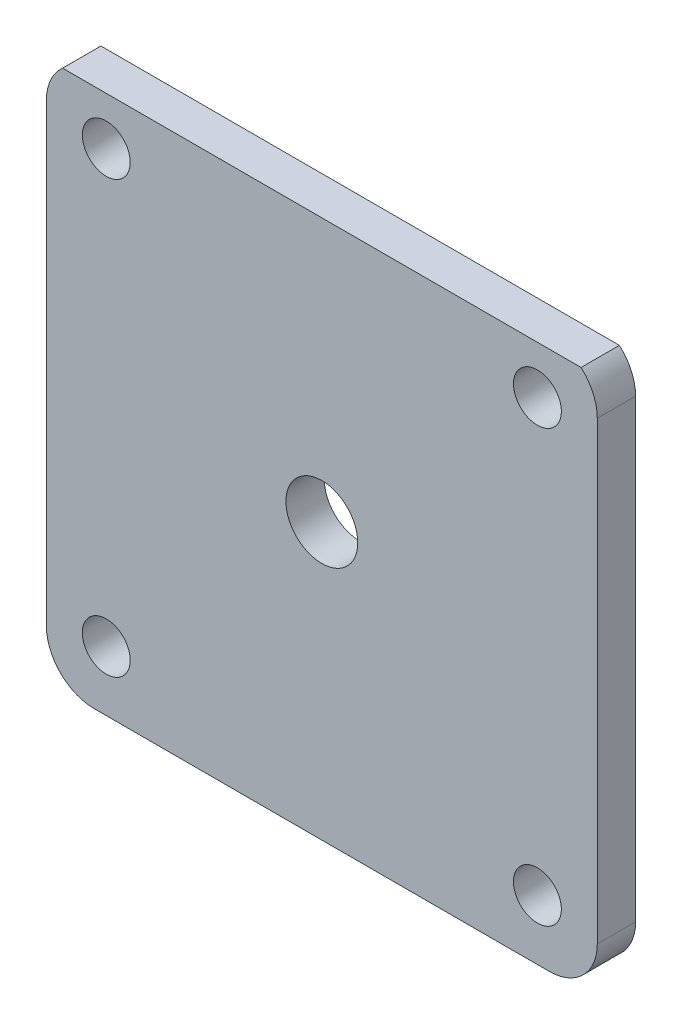
ISO-10303-21;
HEADER;
FILE_DESCRIPTION(('STEP AP214'),'2;1');
FILE_NAME('part.step','',(''),(''),'','','');
FILE_SCHEMA(('AUTOMOTIVE_DESIGN { 1 0 10303 214 1 1 1 1 }'));
ENDSEC;
DATA;
#1=APPLICATION_CONTEXT('core data for automotive mechanical design processes');
#2=APPLICATION_PROTOCOL_DEFINITION('international standard','automotive_design',2000,#1);
#3=PRODUCT_CONTEXT('',#1,'mechanical');
#4=PRODUCT('Part','Part','',(#3));
#5=PRODUCT_RELATED_PRODUCT_CATEGORY('part','',(#4));
#6=PRODUCT_DEFINITION_FORMATION('','',#4);
#7=PRODUCT_DEFINITION_CONTEXT('part definition',#1,'design');
#8=PRODUCT_DEFINITION('design','',#6,#7);
#9=PRODUCT_DEFINITION_SHAPE('','',#8);
#10=(LENGTH_UNIT() NAMED_UNIT(*) SI_UNIT(.MILLI.,.METRE.));
#11=(NAMED_UNIT(*) PLANE_ANGLE_UNIT() SI_UNIT($,.RADIAN.));
#12=(NAMED_UNIT(*) SI_UNIT($,.STERADIAN.) SOLID_ANGLE_UNIT());
#13=UNCERTAINTY_MEASURE_WITH_UNIT(LENGTH_MEASURE(1.E-05),#10,'distance_accuracy_value','');
#14=(GEOMETRIC_REPRESENTATION_CONTEXT(3) GLOBAL_UNCERTAINTY_ASSIGNED_CONTEXT((#13)) GLOBAL_UNIT_ASSIGNED_CONTEXT((#10,
#11,#12)) REPRESENTATION_CONTEXT('',''));
#15=CARTESIAN_POINT('',(0.,0.,0.));
#16=DIRECTION('',(0.,0.,1.));
#17=DIRECTION('',(1.,0.,0.));
#18=AXIS2_PLACEMENT_3D('',#15,#16,#17);
#19=CARTESIAN_POINT('',(9.5,-9.5,1.6));
#20=DIRECTION('',(0.,0.,1.));
#21=DIRECTION('',(1.,0.,0.));
#22=AXIS2_PLACEMENT_3D('',#19,#20,#21);
#23=PLANE('',#22);
#24=DIRECTION('',(1.,0.,0.));
#25=VECTOR('',#24,1.);
#26=CARTESIAN_POINT('',(9.5,11.,1.6));
#27=LINE('',#26,#25);
#28=CARTESIAN_POINT('',(-10.8228756555323,11.,1.6));
#29=VERTEX_POINT('',#28);
#30=CARTESIAN_POINT('',(10.8228756555323,11.,1.6));
#31=VERTEX_POINT('',#30);
#32=EDGE_CURVE('E194',#29,#31,#27,.T.);
#33=ORIENTED_EDGE('',*,*,#32,.F.);
#34=CARTESIAN_POINT('',(-9.5,9.5,1.6));
#35=DIRECTION('',(0.,0.,1.));
#36=DIRECTION('',(-1.,0.,0.));
#37=AXIS2_PLACEMENT_3D('',#34,#35,#36);
#38=CIRCLE('',#37,2.);
#39=CARTESIAN_POINT('',(-11.5,9.49999999999999,1.6));
#40=VERTEX_POINT('',#39);
#41=EDGE_CURVE('E116',#29,#40,#38,.T.);
#42=ORIENTED_EDGE('',*,*,#41,.T.);
#43=DIRECTION('',(0.,-1.,0.));
#44=VECTOR('',#43,1.);
#45=CARTESIAN_POINT('',(-11.5,-9.5,1.6));
#46=LINE('',#45,#44);
#47=CARTESIAN_POINT('',(-11.5,-9.5,1.6));
#48=VERTEX_POINT('',#47);
#49=EDGE_CURVE('E108',#40,#48,#46,.T.);
#50=ORIENTED_EDGE('',*,*,#49,.T.);
#51=CARTESIAN_POINT('',(-9.5,-9.5,1.6));
#52=DIRECTION('',(0.,0.,1.));
#53=DIRECTION('',(-1.,0.,0.));
#54=AXIS2_PLACEMENT_3D('',#51,#52,#53);
#55=CIRCLE('',#54,2.);
#56=CARTESIAN_POINT('',(-9.5,-11.5,1.6));
#57=VERTEX_POINT('',#56);
#58=EDGE_CURVE('E113',#48,#57,#55,.T.);
#59=ORIENTED_EDGE('',*,*,#58,.T.);
#60=DIRECTION('',(1.,0.,0.));
#61=VECTOR('',#60,1.);
#62=CARTESIAN_POINT('',(-9.5,-11.5,1.6));
#63=LINE('',#62,#61);
#64=CARTESIAN_POINT('',(9.50000000000001,-11.5,1.6));
#65=VERTEX_POINT('',#64);
#66=EDGE_CURVE('E63',#57,#65,#63,.T.);
#67=ORIENTED_EDGE('',*,*,#66,.T.);
#68=CARTESIAN_POINT('',(9.5,-9.5,1.6));
#69=DIRECTION('',(0.,0.,1.));
#70=DIRECTION('',(1.,0.,0.));
#71=AXIS2_PLACEMENT_3D('',#68,#69,#70);
#72=CIRCLE('',#71,2.);
#73=CARTESIAN_POINT('',(11.5,-9.5,1.6));
#74=VERTEX_POINT('',#73);
#75=EDGE_CURVE('E163',#65,#74,#72,.T.);
#76=ORIENTED_EDGE('',*,*,#75,.T.);
#77=DIRECTION('',(0.,1.,0.));
#78=VECTOR('',#77,1.);
#79=CARTESIAN_POINT('',(11.5,-9.5,1.6));
#80=LINE('',#79,#78);
#81=CARTESIAN_POINT('',(11.5,9.5,1.6));
#82=VERTEX_POINT('',#81);
#83=EDGE_CURVE('E99',#74,#82,#80,.T.);
#84=ORIENTED_EDGE('',*,*,#83,.T.);
#85=CARTESIAN_POINT('',(9.5,9.5,1.6));
#86=DIRECTION('',(0.,0.,1.));
#87=DIRECTION('',(-1.,0.,0.));
#88=AXIS2_PLACEMENT_3D('',#85,#86,#87);
#89=CIRCLE('',#88,2.);
#90=EDGE_CURVE('E246',#82,#31,#89,.T.);
#91=ORIENTED_EDGE('',*,*,#90,.T.);
#92=EDGE_LOOP('',(#33,#42,#50,#59,#67,#76,#84,#91));
#93=FACE_BOUND('',#92,.T.);
#94=CARTESIAN_POINT('',(-9.,-9.,1.6));
#95=DIRECTION('',(0.,0.,1.));
#96=DIRECTION('',(1.,0.,0.));
#97=AXIS2_PLACEMENT_3D('',#94,#95,#96);
#98=CIRCLE('',#97,1.);
#99=CARTESIAN_POINT('',(-8.,-9.,1.6));
#100=VERTEX_POINT('',#99);
#101=EDGE_CURVE('E212',#100,#100,#98,.T.);
#102=ORIENTED_EDGE('',*,*,#101,.F.);
#103=EDGE_LOOP('',(#102));
#104=FACE_BOUND('',#103,.T.);
#105=CARTESIAN_POINT('',(9.,9.,1.6));
#106=DIRECTION('',(0.,0.,1.));
#107=DIRECTION('',(1.,0.,0.));
#108=AXIS2_PLACEMENT_3D('',#105,#106,#107);
#109=CIRCLE('',#108,0.999999999999999);
#110=CARTESIAN_POINT('',(10.,9.,1.6));
#111=VERTEX_POINT('',#110);
#112=EDGE_CURVE('E228',#111,#111,#109,.T.);
#113=ORIENTED_EDGE('',*,*,#112,.F.);
#114=EDGE_LOOP('',(#113));
#115=FACE_BOUND('',#114,.T.);
#116=CARTESIAN_POINT('',(0.,0.,1.6));
#117=DIRECTION('',(0.,0.,1.));
#118=DIRECTION('',(1.,0.,0.));
#119=AXIS2_PLACEMENT_3D('',#116,#117,#118);
#120=CIRCLE('',#119,1.5);
#121=CARTESIAN_POINT('',(1.5,0.,1.6));
#122=VERTEX_POINT('',#121);
#123=EDGE_CURVE('E146',#122,#122,#120,.T.);
#124=ORIENTED_EDGE('',*,*,#123,.F.);
#125=EDGE_LOOP('',(#124));
#126=FACE_BOUND('',#125,.T.);
#127=CARTESIAN_POINT('',(-9.,8.99999999999999,1.6));
#128=DIRECTION('',(0.,0.,1.));
#129=DIRECTION('',(-1.,0.,0.));
#130=AXIS2_PLACEMENT_3D('',#127,#128,#129);
#131=CIRCLE('',#130,0.999999999999999);
#132=CARTESIAN_POINT('',(-10.,8.99999999999999,1.6));
#133=VERTEX_POINT('',#132);
#134=EDGE_CURVE('E220',#133,#133,#131,.T.);
#135=ORIENTED_EDGE('',*,*,#134,.F.);
#136=EDGE_LOOP('',(#135));
#137=FACE_BOUND('',#136,.T.);
#138=CARTESIAN_POINT('',(9.00000000000001,-9.,1.6));
#139=DIRECTION('',(0.,0.,1.));
#140=DIRECTION('',(-1.,0.,0.));
#141=AXIS2_PLACEMENT_3D('',#138,#139,#140);
#142=CIRCLE('',#141,0.999999999999998);
#143=CARTESIAN_POINT('',(8.00000000000001,-9.,1.6));
#144=VERTEX_POINT('',#143);
#145=EDGE_CURVE('E204',#144,#144,#142,.T.);
#146=ORIENTED_EDGE('',*,*,#145,.F.);
#147=EDGE_LOOP('',(#146));
#148=FACE_BOUND('',#147,.T.);
#149=ADVANCED_FACE('F39',(#93,#104,#115,#126,#137,#148),#23,.T.);
#150=CARTESIAN_POINT('',(9.5,-9.5,0.));
#151=DIRECTION('',(0.,0.,1.));
#152=DIRECTION('',(1.,0.,0.));
#153=AXIS2_PLACEMENT_3D('',#150,#151,#152);
#154=PLANE('',#153);
#155=CARTESIAN_POINT('',(-9.5,9.5,0.));
#156=DIRECTION('',(0.,0.,1.));
#157=DIRECTION('',(-1.,0.,0.));
#158=AXIS2_PLACEMENT_3D('',#155,#156,#157);
#159=CIRCLE('',#158,2.);
#160=CARTESIAN_POINT('',(-10.8228756555323,11.,0.));
#161=VERTEX_POINT('',#160);
#162=CARTESIAN_POINT('',(-11.5,9.49999999999999,0.));
#163=VERTEX_POINT('',#162);
#164=EDGE_CURVE('E153',#161,#163,#159,.T.);
#165=ORIENTED_EDGE('',*,*,#164,.F.);
#166=DIRECTION('',(-1.,0.,0.));
#167=VECTOR('',#166,1.);
#168=CARTESIAN_POINT('',(-12.53493011487,11.,0.));
#169=LINE('',#168,#167);
#170=CARTESIAN_POINT('',(10.8228756555323,11.,0.));
#171=VERTEX_POINT('',#170);
#172=EDGE_CURVE('E55',#171,#161,#169,.T.);
#173=ORIENTED_EDGE('',*,*,#172,.F.);
#174=CARTESIAN_POINT('',(9.5,9.5,0.));
#175=DIRECTION('',(0.,0.,1.));
#176=DIRECTION('',(-1.,0.,0.));
#177=AXIS2_PLACEMENT_3D('',#174,#175,#176);
#178=CIRCLE('',#177,2.);
#179=CARTESIAN_POINT('',(11.5,9.5,0.));
#180=VERTEX_POINT('',#179);
#181=EDGE_CURVE('E149',#180,#171,#178,.T.);
#182=ORIENTED_EDGE('',*,*,#181,.F.);
#183=DIRECTION('',(0.,1.,0.));
#184=VECTOR('',#183,1.);
#185=CARTESIAN_POINT('',(11.5,-9.5,0.));
#186=LINE('',#185,#184);
#187=CARTESIAN_POINT('',(11.5,-9.5,0.));
#188=VERTEX_POINT('',#187);
#189=EDGE_CURVE('E145',#188,#180,#186,.T.);
#190=ORIENTED_EDGE('',*,*,#189,.F.);
#191=CARTESIAN_POINT('',(9.5,-9.5,0.));
#192=DIRECTION('',(0.,0.,1.));
#193=DIRECTION('',(1.,0.,0.));
#194=AXIS2_PLACEMENT_3D('',#191,#192,#193);
#195=CIRCLE('',#194,2.);
#196=CARTESIAN_POINT('',(9.50000000000001,-11.5,0.));
#197=VERTEX_POINT('',#196);
#198=EDGE_CURVE('E141',#197,#188,#195,.T.);
#199=ORIENTED_EDGE('',*,*,#198,.F.);
#200=DIRECTION('',(1.,0.,0.));
#201=VECTOR('',#200,1.);
#202=CARTESIAN_POINT('',(-9.5,-11.5,0.));
#203=LINE('',#202,#201);
#204=CARTESIAN_POINT('',(-9.5,-11.5,0.));
#205=VERTEX_POINT('',#204);
#206=EDGE_CURVE('E90',#205,#197,#203,.T.);
#207=ORIENTED_EDGE('',*,*,#206,.F.);
#208=CARTESIAN_POINT('',(-9.5,-9.5,0.));
#209=DIRECTION('',(0.,0.,1.));
#210=DIRECTION('',(-1.,0.,0.));
#211=AXIS2_PLACEMENT_3D('',#208,#209,#210);
#212=CIRCLE('',#211,2.);
#213=CARTESIAN_POINT('',(-11.5,-9.5,0.));
#214=VERTEX_POINT('',#213);
#215=EDGE_CURVE('E158',#214,#205,#212,.T.);
#216=ORIENTED_EDGE('',*,*,#215,.F.);
#217=DIRECTION('',(0.,-1.,0.));
#218=VECTOR('',#217,1.);
#219=CARTESIAN_POINT('',(-11.5,-9.5,0.));
#220=LINE('',#219,#218);
#221=EDGE_CURVE('E126',#163,#214,#220,.T.);
#222=ORIENTED_EDGE('',*,*,#221,.F.);
#223=EDGE_LOOP('',(#165,#173,#182,#190,#199,#207,#216,#222));
#224=FACE_BOUND('',#223,.T.);
#225=CARTESIAN_POINT('',(0.,0.,0.));
#226=DIRECTION('',(0.,0.,1.));
#227=DIRECTION('',(1.,0.,0.));
#228=AXIS2_PLACEMENT_3D('',#225,#226,#227);
#229=CIRCLE('',#228,1.5);
#230=CARTESIAN_POINT('',(1.5,0.,0.));
#231=VERTEX_POINT('',#230);
#232=EDGE_CURVE('E232',#231,#231,#229,.T.);
#233=ORIENTED_EDGE('',*,*,#232,.T.);
#234=EDGE_LOOP('',(#233));
#235=FACE_BOUND('',#234,.T.);
#236=CARTESIAN_POINT('',(9.,9.,0.));
#237=DIRECTION('',(0.,0.,1.));
#238=DIRECTION('',(1.,0.,0.));
#239=AXIS2_PLACEMENT_3D('',#236,#237,#238);
#240=CIRCLE('',#239,0.999999999999999);
#241=CARTESIAN_POINT('',(10.,9.,0.));
#242=VERTEX_POINT('',#241);
#243=EDGE_CURVE('E224',#242,#242,#240,.T.);
#244=ORIENTED_EDGE('',*,*,#243,.T.);
#245=EDGE_LOOP('',(#244));
#246=FACE_BOUND('',#245,.T.);
#247=CARTESIAN_POINT('',(-9.,8.99999999999999,0.));
#248=DIRECTION('',(0.,0.,1.));
#249=DIRECTION('',(-1.,0.,0.));
#250=AXIS2_PLACEMENT_3D('',#247,#248,#249);
#251=CIRCLE('',#250,0.999999999999999);
#252=CARTESIAN_POINT('',(-10.,8.99999999999999,0.));
#253=VERTEX_POINT('',#252);
#254=EDGE_CURVE('E216',#253,#253,#251,.T.);
#255=ORIENTED_EDGE('',*,*,#254,.T.);
#256=EDGE_LOOP('',(#255));
#257=FACE_BOUND('',#256,.T.);
#258=CARTESIAN_POINT('',(-9.,-9.,0.));
#259=DIRECTION('',(0.,0.,1.));
#260=DIRECTION('',(1.,0.,0.));
#261=AXIS2_PLACEMENT_3D('',#258,#259,#260);
#262=CIRCLE('',#261,1.);
#263=CARTESIAN_POINT('',(-8.,-9.,0.));
#264=VERTEX_POINT('',#263);
#265=EDGE_CURVE('E208',#264,#264,#262,.T.);
#266=ORIENTED_EDGE('',*,*,#265,.T.);
#267=EDGE_LOOP('',(#266));
#268=FACE_BOUND('',#267,.T.);
#269=CARTESIAN_POINT('',(9.00000000000001,-9.,0.));
#270=DIRECTION('',(0.,0.,1.));
#271=DIRECTION('',(-1.,0.,0.));
#272=AXIS2_PLACEMENT_3D('',#269,#270,#271);
#273=CIRCLE('',#272,0.999999999999998);
#274=CARTESIAN_POINT('',(8.00000000000001,-9.,0.));
#275=VERTEX_POINT('',#274);
#276=EDGE_CURVE('E200',#275,#275,#273,.T.);
#277=ORIENTED_EDGE('',*,*,#276,.T.);
#278=EDGE_LOOP('',(#277));
#279=FACE_BOUND('',#278,.T.);
#280=ADVANCED_FACE('F181',(#224,#235,#246,#257,#268,#279),#154,.F.);
#281=CARTESIAN_POINT('',(9.5,-9.5,1.6));
#282=DIRECTION('',(0.,0.,-1.));
#283=DIRECTION('',(-1.,0.,0.));
#284=AXIS2_PLACEMENT_3D('',#281,#282,#283);
#285=CYLINDRICAL_SURFACE('',#284,2.);
#286=ORIENTED_EDGE('',*,*,#198,.T.);
#287=DIRECTION('',(0.,0.,-1.));
#288=VECTOR('',#287,1.);
#289=CARTESIAN_POINT('',(11.5,-9.5,1.6));
#290=LINE('',#289,#288);
#291=EDGE_CURVE('E48',#74,#188,#290,.T.);
#292=ORIENTED_EDGE('',*,*,#291,.F.);
#293=ORIENTED_EDGE('',*,*,#75,.F.);
#294=DIRECTION('',(0.,0.,-1.));
#295=VECTOR('',#294,1.);
#296=CARTESIAN_POINT('',(9.50000000000001,-11.5,1.6));
#297=LINE('',#296,#295);
#298=EDGE_CURVE('E137',#65,#197,#297,.T.);
#299=ORIENTED_EDGE('',*,*,#298,.T.);
#300=EDGE_LOOP('',(#286,#292,#293,#299));
#301=FACE_BOUND('',#300,.T.);
#302=ADVANCED_FACE('F41',(#301),#285,.T.);
#303=CARTESIAN_POINT('',(11.5,-9.5,1.6));
#304=DIRECTION('',(-1.,0.,0.));
#305=DIRECTION('',(0.,-1.,0.));
#306=AXIS2_PLACEMENT_3D('',#303,#304,#305);
#307=PLANE('',#306);
#308=ORIENTED_EDGE('',*,*,#189,.T.);
#309=DIRECTION('',(0.,0.,-1.));
#310=VECTOR('',#309,1.);
#311=CARTESIAN_POINT('',(11.5,9.5,1.6));
#312=LINE('',#311,#310);
#313=EDGE_CURVE('E170',#82,#180,#312,.T.);
#314=ORIENTED_EDGE('',*,*,#313,.F.);
#315=ORIENTED_EDGE('',*,*,#83,.F.);
#316=ORIENTED_EDGE('',*,*,#291,.T.);
#317=EDGE_LOOP('',(#308,#314,#315,#316));
#318=FACE_BOUND('',#317,.T.);
#319=ADVANCED_FACE('F175',(#318),#307,.F.);
#320=CARTESIAN_POINT('',(9.5,9.5,1.6));
#321=DIRECTION('',(0.,0.,-1.));
#322=DIRECTION('',(-1.,0.,0.));
#323=AXIS2_PLACEMENT_3D('',#320,#321,#322);
#324=CYLINDRICAL_SURFACE('',#323,2.);
#325=ORIENTED_EDGE('',*,*,#181,.T.);
#326=DIRECTION('',(0.,0.,-1.));
#327=VECTOR('',#326,1.);
#328=CARTESIAN_POINT('',(10.8228756555323,11.,1.6));
#329=LINE('',#328,#327);
#330=EDGE_CURVE('E189',#171,#31,#329,.F.);
#331=ORIENTED_EDGE('',*,*,#330,.T.);
#332=ORIENTED_EDGE('',*,*,#90,.F.);
#333=ORIENTED_EDGE('',*,*,#313,.T.);
#334=EDGE_LOOP('',(#325,#331,#332,#333));
#335=FACE_BOUND('',#334,.T.);
#336=ADVANCED_FACE('F187',(#335),#324,.T.);
#337=CARTESIAN_POINT('',(-9.5,9.5,1.6));
#338=DIRECTION('',(0.,0.,-1.));
#339=DIRECTION('',(-1.,0.,0.));
#340=AXIS2_PLACEMENT_3D('',#337,#338,#339);
#341=CYLINDRICAL_SURFACE('',#340,2.);
#342=ORIENTED_EDGE('',*,*,#41,.F.);
#343=DIRECTION('',(0.,0.,-1.));
#344=VECTOR('',#343,1.);
#345=CARTESIAN_POINT('',(-10.8228756555323,11.,1.6));
#346=LINE('',#345,#344);
#347=EDGE_CURVE('E11',#29,#161,#346,.T.);
#348=ORIENTED_EDGE('',*,*,#347,.T.);
#349=ORIENTED_EDGE('',*,*,#164,.T.);
#350=DIRECTION('',(0.,0.,-1.));
#351=VECTOR('',#350,1.);
#352=CARTESIAN_POINT('',(-11.5,9.49999999999999,1.6));
#353=LINE('',#352,#351);
#354=EDGE_CURVE('E130',#40,#163,#353,.T.);
#355=ORIENTED_EDGE('',*,*,#354,.F.);
#356=EDGE_LOOP('',(#342,#348,#349,#355));
#357=FACE_BOUND('',#356,.T.);
#358=ADVANCED_FACE('F277',(#357),#341,.T.);
#359=CARTESIAN_POINT('',(-11.5,-9.5,1.6));
#360=DIRECTION('',(1.,0.,0.));
#361=DIRECTION('',(0.,1.,0.));
#362=AXIS2_PLACEMENT_3D('',#359,#360,#361);
#363=PLANE('',#362);
#364=ORIENTED_EDGE('',*,*,#221,.T.);
#365=DIRECTION('',(0.,0.,-1.));
#366=VECTOR('',#365,1.);
#367=CARTESIAN_POINT('',(-11.5,-9.5,1.6));
#368=LINE('',#367,#366);
#369=EDGE_CURVE('E123',#48,#214,#368,.T.);
#370=ORIENTED_EDGE('',*,*,#369,.F.);
#371=ORIENTED_EDGE('',*,*,#49,.F.);
#372=ORIENTED_EDGE('',*,*,#354,.T.);
#373=EDGE_LOOP('',(#364,#370,#371,#372));
#374=FACE_BOUND('',#373,.T.);
#375=ADVANCED_FACE('F124',(#374),#363,.F.);
#376=CARTESIAN_POINT('',(-9.5,-9.5,1.6));
#377=DIRECTION('',(0.,0.,-1.));
#378=DIRECTION('',(-1.,0.,0.));
#379=AXIS2_PLACEMENT_3D('',#376,#377,#378);
#380=CYLINDRICAL_SURFACE('',#379,2.);
#381=ORIENTED_EDGE('',*,*,#215,.T.);
#382=DIRECTION('',(0.,0.,-1.));
#383=VECTOR('',#382,1.);
#384=CARTESIAN_POINT('',(-9.5,-11.5,1.6));
#385=LINE('',#384,#383);
#386=EDGE_CURVE('E131',#57,#205,#385,.T.);
#387=ORIENTED_EDGE('',*,*,#386,.F.);
#388=ORIENTED_EDGE('',*,*,#58,.F.);
#389=ORIENTED_EDGE('',*,*,#369,.T.);
#390=EDGE_LOOP('',(#381,#387,#388,#389));
#391=FACE_BOUND('',#390,.T.);
#392=ADVANCED_FACE('F133',(#391),#380,.T.);
#393=CARTESIAN_POINT('',(-9.5,-11.5,1.6));
#394=DIRECTION('',(0.,1.,0.));
#395=DIRECTION('',(-1.,0.,0.));
#396=AXIS2_PLACEMENT_3D('',#393,#394,#395);
#397=PLANE('',#396);
#398=ORIENTED_EDGE('',*,*,#206,.T.);
#399=ORIENTED_EDGE('',*,*,#298,.F.);
#400=ORIENTED_EDGE('',*,*,#66,.F.);
#401=ORIENTED_EDGE('',*,*,#386,.T.);
#402=EDGE_LOOP('',(#398,#399,#400,#401));
#403=FACE_BOUND('',#402,.T.);
#404=ADVANCED_FACE('F255',(#403),#397,.F.);
#405=CARTESIAN_POINT('',(0.,0.,1.6));
#406=DIRECTION('',(0.,0.,-1.));
#407=DIRECTION('',(-1.,0.,0.));
#408=AXIS2_PLACEMENT_3D('',#405,#406,#407);
#409=CYLINDRICAL_SURFACE('',#408,1.5);
#410=ORIENTED_EDGE('',*,*,#123,.T.);
#411=EDGE_LOOP('',(#410));
#412=FACE_BOUND('',#411,.T.);
#413=ORIENTED_EDGE('',*,*,#232,.F.);
#414=EDGE_LOOP('',(#413));
#415=FACE_BOUND('',#414,.T.);
#416=ADVANCED_FACE('F252',(#412,#415),#409,.F.);
#417=CARTESIAN_POINT('',(9.,9.,1.6));
#418=DIRECTION('',(0.,0.,-1.));
#419=DIRECTION('',(-1.,0.,0.));
#420=AXIS2_PLACEMENT_3D('',#417,#418,#419);
#421=CYLINDRICAL_SURFACE('',#420,0.999999999999999);
#422=ORIENTED_EDGE('',*,*,#112,.T.);
#423=EDGE_LOOP('',(#422));
#424=FACE_BOUND('',#423,.T.);
#425=ORIENTED_EDGE('',*,*,#243,.F.);
#426=EDGE_LOOP('',(#425));
#427=FACE_BOUND('',#426,.T.);
#428=ADVANCED_FACE('F254',(#424,#427),#421,.F.);
#429=CARTESIAN_POINT('',(-9.,8.99999999999999,1.6));
#430=DIRECTION('',(0.,0.,-1.));
#431=DIRECTION('',(-1.,0.,0.));
#432=AXIS2_PLACEMENT_3D('',#429,#430,#431);
#433=CYLINDRICAL_SURFACE('',#432,0.999999999999999);
#434=ORIENTED_EDGE('',*,*,#134,.T.);
#435=EDGE_LOOP('',(#434));
#436=FACE_BOUND('',#435,.T.);
#437=ORIENTED_EDGE('',*,*,#254,.F.);
#438=EDGE_LOOP('',(#437));
#439=FACE_BOUND('',#438,.T.);
#440=ADVANCED_FACE('F262',(#436,#439),#433,.F.);
#441=CARTESIAN_POINT('',(-9.,-9.,1.6));
#442=DIRECTION('',(0.,0.,-1.));
#443=DIRECTION('',(-1.,0.,0.));
#444=AXIS2_PLACEMENT_3D('',#441,#442,#443);
#445=CYLINDRICAL_SURFACE('',#444,1.);
#446=ORIENTED_EDGE('',*,*,#101,.T.);
#447=EDGE_LOOP('',(#446));
#448=FACE_BOUND('',#447,.T.);
#449=ORIENTED_EDGE('',*,*,#265,.F.);
#450=EDGE_LOOP('',(#449));
#451=FACE_BOUND('',#450,.T.);
#452=ADVANCED_FACE('F326',(#448,#451),#445,.F.);
#453=CARTESIAN_POINT('',(9.00000000000001,-9.,1.6));
#454=DIRECTION('',(0.,0.,-1.));
#455=DIRECTION('',(-1.,0.,0.));
#456=AXIS2_PLACEMENT_3D('',#453,#454,#455);
#457=CYLINDRICAL_SURFACE('',#456,0.999999999999998);
#458=ORIENTED_EDGE('',*,*,#145,.T.);
#459=EDGE_LOOP('',(#458));
#460=FACE_BOUND('',#459,.T.);
#461=ORIENTED_EDGE('',*,*,#276,.F.);
#462=EDGE_LOOP('',(#461));
#463=FACE_BOUND('',#462,.T.);
#464=ADVANCED_FACE('F317',(#460,#463),#457,.F.);
#465=CARTESIAN_POINT('',(-12.53493011487,11.,10.));
#466=DIRECTION('',(0.,-1.,0.));
#467=DIRECTION('',(0.,0.,-1.));
#468=AXIS2_PLACEMENT_3D('',#465,#466,#467);
#469=PLANE('',#468);
#470=ORIENTED_EDGE('',*,*,#172,.T.);
#471=ORIENTED_EDGE('',*,*,#347,.F.);
#472=ORIENTED_EDGE('',*,*,#32,.T.);
#473=ORIENTED_EDGE('',*,*,#330,.F.);
#474=EDGE_LOOP('',(#470,#471,#472,#473));
#475=FACE_BOUND('',#474,.T.);
#476=ADVANCED_FACE('F195',(#475),#469,.F.);
#477=CLOSED_SHELL('',(#149,#280,#302,#319,#336,#358,#375,#392,#404,#416,#428,#440,#452,#464,#476));
#478=MANIFOLD_SOLID_BREP('B2',#477);
#479=ADVANCED_BREP_SHAPE_REPRESENTATION('',(#18,#478),#14);
#480=SHAPE_DEFINITION_REPRESENTATION(#9,#479);
ENDSEC;
END-ISO-10303-21;
